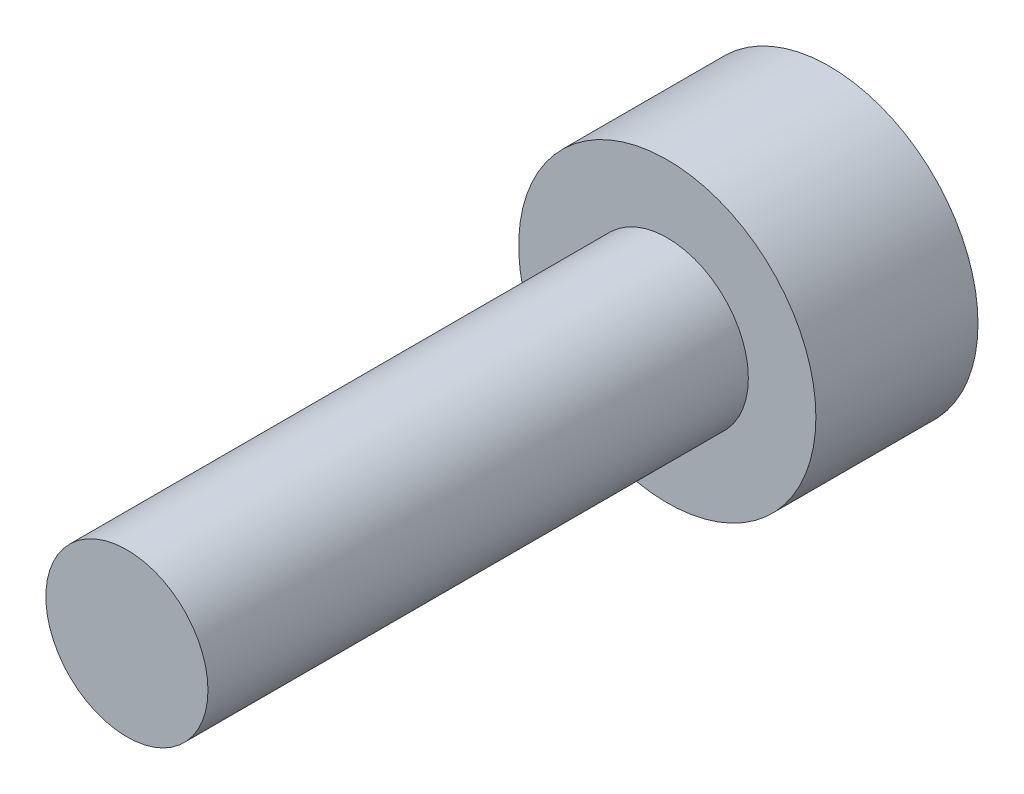
ISO-10303-21;
HEADER;
FILE_DESCRIPTION(('STEP AP214'),'2;1');
FILE_NAME('part.step','',(''),(''),'','','');
FILE_SCHEMA(('AUTOMOTIVE_DESIGN { 1 0 10303 214 1 1 1 1 }'));
ENDSEC;
DATA;
#1=APPLICATION_CONTEXT('core data for automotive mechanical design processes');
#2=APPLICATION_PROTOCOL_DEFINITION('international standard','automotive_design',2000,#1);
#3=PRODUCT_CONTEXT('',#1,'mechanical');
#4=PRODUCT('Part','Part','',(#3));
#5=PRODUCT_RELATED_PRODUCT_CATEGORY('part','',(#4));
#6=PRODUCT_DEFINITION_FORMATION('','',#4);
#7=PRODUCT_DEFINITION_CONTEXT('part definition',#1,'design');
#8=PRODUCT_DEFINITION('design','',#6,#7);
#9=PRODUCT_DEFINITION_SHAPE('','',#8);
#10=(LENGTH_UNIT() NAMED_UNIT(*) SI_UNIT(.MILLI.,.METRE.));
#11=(NAMED_UNIT(*) PLANE_ANGLE_UNIT() SI_UNIT($,.RADIAN.));
#12=(NAMED_UNIT(*) SI_UNIT($,.STERADIAN.) SOLID_ANGLE_UNIT());
#13=UNCERTAINTY_MEASURE_WITH_UNIT(LENGTH_MEASURE(1.E-05),#10,'distance_accuracy_value','');
#14=(GEOMETRIC_REPRESENTATION_CONTEXT(3) GLOBAL_UNCERTAINTY_ASSIGNED_CONTEXT((#13)) GLOBAL_UNIT_ASSIGNED_CONTEXT((#10,
#11,#12)) REPRESENTATION_CONTEXT('',''));
#15=CARTESIAN_POINT('',(0.,0.,0.));
#16=DIRECTION('',(0.,0.,1.));
#17=DIRECTION('',(1.,0.,0.));
#18=AXIS2_PLACEMENT_3D('',#15,#16,#17);
#19=CARTESIAN_POINT('',(0.,0.,0.));
#20=DIRECTION('',(0.,0.,-1.));
#21=DIRECTION('',(-1.,0.,0.));
#22=AXIS2_PLACEMENT_3D('',#19,#20,#21);
#23=CYLINDRICAL_SURFACE('',#22,2.75);
#24=CARTESIAN_POINT('',(0.,0.,0.));
#25=DIRECTION('',(0.,0.,1.));
#26=DIRECTION('',(1.,0.,0.));
#27=AXIS2_PLACEMENT_3D('',#24,#25,#26);
#28=CIRCLE('',#27,2.75);
#29=CARTESIAN_POINT('',(2.75,0.,0.));
#30=VERTEX_POINT('',#29);
#31=EDGE_CURVE('E42',#30,#30,#28,.T.);
#32=ORIENTED_EDGE('',*,*,#31,.F.);
#33=EDGE_LOOP('',(#32));
#34=FACE_BOUND('',#33,.T.);
#35=CARTESIAN_POINT('',(0.,0.,-3.));
#36=DIRECTION('',(0.,0.,1.));
#37=DIRECTION('',(1.,0.,0.));
#38=AXIS2_PLACEMENT_3D('',#35,#36,#37);
#39=CIRCLE('',#38,2.75);
#40=CARTESIAN_POINT('',(2.75,0.,-3.));
#41=VERTEX_POINT('',#40);
#42=EDGE_CURVE('E37',#41,#41,#39,.T.);
#43=ORIENTED_EDGE('',*,*,#42,.T.);
#44=EDGE_LOOP('',(#43));
#45=FACE_BOUND('',#44,.T.);
#46=ADVANCED_FACE('F40',(#34,#45),#23,.T.);
#47=CARTESIAN_POINT('',(0.,0.,0.));
#48=DIRECTION('',(0.,0.,1.));
#49=DIRECTION('',(1.,0.,0.));
#50=AXIS2_PLACEMENT_3D('',#47,#48,#49);
#51=PLANE('',#50);
#52=CARTESIAN_POINT('',(0.,0.,0.));
#53=DIRECTION('',(0.,0.,1.));
#54=DIRECTION('',(1.,0.,0.));
#55=AXIS2_PLACEMENT_3D('',#52,#53,#54);
#56=CIRCLE('',#55,1.5);
#57=CARTESIAN_POINT('',(1.5,0.,0.));
#58=VERTEX_POINT('',#57);
#59=EDGE_CURVE('E10',#58,#58,#56,.T.);
#60=ORIENTED_EDGE('',*,*,#59,.F.);
#61=EDGE_LOOP('',(#60));
#62=FACE_BOUND('',#61,.T.);
#63=ORIENTED_EDGE('',*,*,#31,.T.);
#64=EDGE_LOOP('',(#63));
#65=FACE_BOUND('',#64,.T.);
#66=ADVANCED_FACE('F63',(#62,#65),#51,.T.);
#67=CARTESIAN_POINT('',(0.,0.,-3.));
#68=DIRECTION('',(0.,0.,1.));
#69=DIRECTION('',(1.,0.,0.));
#70=AXIS2_PLACEMENT_3D('',#67,#68,#69);
#71=PLANE('',#70);
#72=ORIENTED_EDGE('',*,*,#42,.F.);
#73=EDGE_LOOP('',(#72));
#74=FACE_BOUND('',#73,.T.);
#75=ADVANCED_FACE('F59',(#74),#71,.F.);
#76=CARTESIAN_POINT('',(0.,0.,10.));
#77=DIRECTION('',(0.,0.,-1.));
#78=DIRECTION('',(-1.,0.,0.));
#79=AXIS2_PLACEMENT_3D('',#76,#77,#78);
#80=CYLINDRICAL_SURFACE('',#79,1.5);
#81=CARTESIAN_POINT('',(0.,0.,10.));
#82=DIRECTION('',(0.,0.,1.));
#83=DIRECTION('',(1.,0.,0.));
#84=AXIS2_PLACEMENT_3D('',#81,#82,#83);
#85=CIRCLE('',#84,1.5);
#86=CARTESIAN_POINT('',(1.5,0.,10.));
#87=VERTEX_POINT('',#86);
#88=EDGE_CURVE('E49',#87,#87,#85,.T.);
#89=ORIENTED_EDGE('',*,*,#88,.F.);
#90=EDGE_LOOP('',(#89));
#91=FACE_BOUND('',#90,.T.);
#92=ORIENTED_EDGE('',*,*,#59,.T.);
#93=EDGE_LOOP('',(#92));
#94=FACE_BOUND('',#93,.T.);
#95=ADVANCED_FACE('F58',(#91,#94),#80,.T.);
#96=CARTESIAN_POINT('',(0.,0.,10.));
#97=DIRECTION('',(0.,0.,1.));
#98=DIRECTION('',(1.,0.,0.));
#99=AXIS2_PLACEMENT_3D('',#96,#97,#98);
#100=PLANE('',#99);
#101=ORIENTED_EDGE('',*,*,#88,.T.);
#102=EDGE_LOOP('',(#101));
#103=FACE_BOUND('',#102,.T.);
#104=ADVANCED_FACE('F70',(#103),#100,.T.);
#105=CLOSED_SHELL('',(#46,#66,#75,#95,#104));
#106=MANIFOLD_SOLID_BREP('B2',#105);
#107=ADVANCED_BREP_SHAPE_REPRESENTATION('',(#18,#106),#14);
#108=SHAPE_DEFINITION_REPRESENTATION(#9,#107);
ENDSEC;
END-ISO-10303-21;
